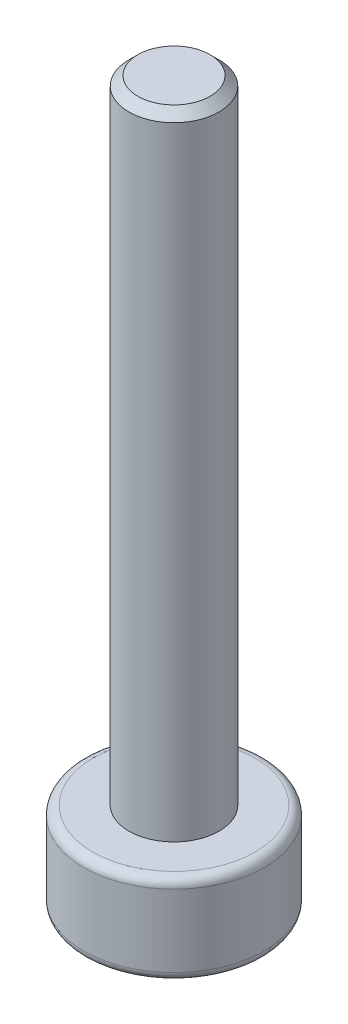
ISO-10303-21;
HEADER;
FILE_DESCRIPTION(('STEP AP214'),'2;1');
FILE_NAME('part.step','',(''),(''),'','','');
FILE_SCHEMA(('AUTOMOTIVE_DESIGN { 1 0 10303 214 1 1 1 1 }'));
ENDSEC;
DATA;
#1=APPLICATION_CONTEXT('core data for automotive mechanical design processes');
#2=APPLICATION_PROTOCOL_DEFINITION('international standard','automotive_design',2000,#1);
#3=PRODUCT_CONTEXT('',#1,'mechanical');
#4=PRODUCT('Part','Part','',(#3));
#5=PRODUCT_RELATED_PRODUCT_CATEGORY('part','',(#4));
#6=PRODUCT_DEFINITION_FORMATION('','',#4);
#7=PRODUCT_DEFINITION_CONTEXT('part definition',#1,'design');
#8=PRODUCT_DEFINITION('design','',#6,#7);
#9=PRODUCT_DEFINITION_SHAPE('','',#8);
#10=(LENGTH_UNIT() NAMED_UNIT(*) SI_UNIT(.MILLI.,.METRE.));
#11=(NAMED_UNIT(*) PLANE_ANGLE_UNIT() SI_UNIT($,.RADIAN.));
#12=(NAMED_UNIT(*) SI_UNIT($,.STERADIAN.) SOLID_ANGLE_UNIT());
#13=UNCERTAINTY_MEASURE_WITH_UNIT(LENGTH_MEASURE(1.E-05),#10,'distance_accuracy_value','');
#14=(GEOMETRIC_REPRESENTATION_CONTEXT(3) GLOBAL_UNCERTAINTY_ASSIGNED_CONTEXT((#13)) GLOBAL_UNIT_ASSIGNED_CONTEXT((#10,
#11,#12)) REPRESENTATION_CONTEXT('',''));
#15=CARTESIAN_POINT('',(0.,0.,0.));
#16=DIRECTION('',(0.,0.,1.));
#17=DIRECTION('',(1.,0.,0.));
#18=AXIS2_PLACEMENT_3D('',#15,#16,#17);
#19=CARTESIAN_POINT('',(0.,2.,0.));
#20=DIRECTION('',(0.,-1.,0.));
#21=DIRECTION('',(0.,0.,-1.));
#22=AXIS2_PLACEMENT_3D('',#19,#20,#21);
#23=CYLINDRICAL_SURFACE('',#22,2.);
#24=CARTESIAN_POINT('',(0.,0.2,0.));
#25=DIRECTION('',(0.,1.,0.));
#26=DIRECTION('',(0.,0.,1.));
#27=AXIS2_PLACEMENT_3D('',#24,#25,#26);
#28=CIRCLE('',#27,2.);
#29=CARTESIAN_POINT('',(0.,0.2,2.));
#30=VERTEX_POINT('',#29);
#31=EDGE_CURVE('E72',#30,#30,#28,.T.);
#32=ORIENTED_EDGE('',*,*,#31,.T.);
#33=EDGE_LOOP('',(#32));
#34=FACE_BOUND('',#33,.T.);
#35=CARTESIAN_POINT('',(0.,1.8,0.));
#36=DIRECTION('',(0.,1.,0.));
#37=DIRECTION('',(0.,0.,1.));
#38=AXIS2_PLACEMENT_3D('',#35,#36,#37);
#39=CIRCLE('',#38,2.);
#40=CARTESIAN_POINT('',(0.,1.8,2.));
#41=VERTEX_POINT('',#40);
#42=EDGE_CURVE('E76',#41,#41,#39,.F.);
#43=ORIENTED_EDGE('',*,*,#42,.T.);
#44=EDGE_LOOP('',(#43));
#45=FACE_BOUND('',#44,.T.);
#46=ADVANCED_FACE('F39',(#34,#45),#23,.T.);
#47=CARTESIAN_POINT('',(0.,2.,0.));
#48=DIRECTION('',(0.,1.,0.));
#49=DIRECTION('',(0.,0.,1.));
#50=AXIS2_PLACEMENT_3D('',#47,#48,#49);
#51=PLANE('',#50);
#52=CARTESIAN_POINT('',(0.,2.,0.));
#53=DIRECTION('',(0.,1.,0.));
#54=DIRECTION('',(0.,0.,1.));
#55=AXIS2_PLACEMENT_3D('',#52,#53,#54);
#56=CIRCLE('',#55,1.8);
#57=CARTESIAN_POINT('',(0.,2.,1.8));
#58=VERTEX_POINT('',#57);
#59=EDGE_CURVE('E64',#58,#58,#56,.T.);
#60=ORIENTED_EDGE('',*,*,#59,.T.);
#61=EDGE_LOOP('',(#60));
#62=FACE_BOUND('',#61,.T.);
#63=CARTESIAN_POINT('',(0.,2.,0.));
#64=DIRECTION('',(0.,1.,0.));
#65=DIRECTION('',(0.,0.,1.));
#66=AXIS2_PLACEMENT_3D('',#63,#64,#65);
#67=CIRCLE('',#66,1.);
#68=CARTESIAN_POINT('',(0.,2.,1.));
#69=VERTEX_POINT('',#68);
#70=EDGE_CURVE('E80',#69,#69,#67,.T.);
#71=ORIENTED_EDGE('',*,*,#70,.F.);
#72=EDGE_LOOP('',(#71));
#73=FACE_BOUND('',#72,.T.);
#74=ADVANCED_FACE('F107',(#62,#73),#51,.T.);
#75=CARTESIAN_POINT('',(0.,0.,0.));
#76=DIRECTION('',(0.,1.,0.));
#77=DIRECTION('',(0.,0.,1.));
#78=AXIS2_PLACEMENT_3D('',#75,#76,#77);
#79=PLANE('',#78);
#80=CARTESIAN_POINT('',(0.,0.,0.));
#81=DIRECTION('',(0.,1.,0.));
#82=DIRECTION('',(0.,0.,1.));
#83=AXIS2_PLACEMENT_3D('',#80,#81,#82);
#84=CIRCLE('',#83,0.864999999999998);
#85=CARTESIAN_POINT('',(0.,0.,-0.864999999999998));
#86=VERTEX_POINT('',#85);
#87=EDGE_CURVE('E53',#86,#86,#84,.T.);
#88=ORIENTED_EDGE('',*,*,#87,.T.);
#89=EDGE_LOOP('',(#88));
#90=FACE_BOUND('',#89,.T.);
#91=CARTESIAN_POINT('',(0.,0.,0.));
#92=DIRECTION('',(0.,1.,0.));
#93=DIRECTION('',(0.,0.,1.));
#94=AXIS2_PLACEMENT_3D('',#91,#92,#93);
#95=CIRCLE('',#94,1.8);
#96=CARTESIAN_POINT('',(0.,0.,1.8));
#97=VERTEX_POINT('',#96);
#98=EDGE_CURVE('E68',#97,#97,#95,.F.);
#99=ORIENTED_EDGE('',*,*,#98,.T.);
#100=EDGE_LOOP('',(#99));
#101=FACE_BOUND('',#100,.T.);
#102=ADVANCED_FACE('F113',(#90,#101),#79,.F.);
#103=CARTESIAN_POINT('',(0.,16.,0.));
#104=DIRECTION('',(0.,-1.,0.));
#105=DIRECTION('',(0.,0.,-1.));
#106=AXIS2_PLACEMENT_3D('',#103,#104,#105);
#107=CYLINDRICAL_SURFACE('',#106,1.);
#108=CARTESIAN_POINT('',(0.,15.8,0.));
#109=DIRECTION('',(0.,1.,0.));
#110=DIRECTION('',(0.,0.,1.));
#111=AXIS2_PLACEMENT_3D('',#108,#109,#110);
#112=CIRCLE('',#111,1.);
#113=CARTESIAN_POINT('',(0.,15.8,1.));
#114=VERTEX_POINT('',#113);
#115=EDGE_CURVE('E10',#114,#114,#112,.F.);
#116=ORIENTED_EDGE('',*,*,#115,.T.);
#117=EDGE_LOOP('',(#116));
#118=FACE_BOUND('',#117,.T.);
#119=ORIENTED_EDGE('',*,*,#70,.T.);
#120=EDGE_LOOP('',(#119));
#121=FACE_BOUND('',#120,.T.);
#122=ADVANCED_FACE('F137',(#118,#121),#107,.T.);
#123=CARTESIAN_POINT('',(0.,16.,0.));
#124=DIRECTION('',(0.,1.,0.));
#125=DIRECTION('',(0.,0.,1.));
#126=AXIS2_PLACEMENT_3D('',#123,#124,#125);
#127=PLANE('',#126);
#128=CARTESIAN_POINT('',(0.,16.,0.));
#129=DIRECTION('',(0.,1.,0.));
#130=DIRECTION('',(0.,0.,1.));
#131=AXIS2_PLACEMENT_3D('',#128,#129,#130);
#132=CIRCLE('',#131,0.800000000000002);
#133=CARTESIAN_POINT('',(0.,16.,0.800000000000002));
#134=VERTEX_POINT('',#133);
#135=EDGE_CURVE('E48',#134,#134,#132,.T.);
#136=ORIENTED_EDGE('',*,*,#135,.T.);
#137=EDGE_LOOP('',(#136));
#138=FACE_BOUND('',#137,.T.);
#139=ADVANCED_FACE('F120',(#138),#127,.T.);
#140=CARTESIAN_POINT('',(0.,0.2,0.));
#141=DIRECTION('',(0.,1.,0.));
#142=DIRECTION('',(0.,0.,1.));
#143=AXIS2_PLACEMENT_3D('',#140,#141,#142);
#144=TOROIDAL_SURFACE('',#143,1.8,0.2);
#145=ORIENTED_EDGE('',*,*,#98,.F.);
#146=EDGE_LOOP('',(#145));
#147=FACE_BOUND('',#146,.T.);
#148=ORIENTED_EDGE('',*,*,#31,.F.);
#149=EDGE_LOOP('',(#148));
#150=FACE_BOUND('',#149,.T.);
#151=ADVANCED_FACE('F102',(#147,#150),#144,.T.);
#152=CARTESIAN_POINT('',(0.,1.8,0.));
#153=DIRECTION('',(0.,1.,0.));
#154=DIRECTION('',(0.,0.,1.));
#155=AXIS2_PLACEMENT_3D('',#152,#153,#154);
#156=TOROIDAL_SURFACE('',#155,1.8,0.2);
#157=ORIENTED_EDGE('',*,*,#42,.F.);
#158=EDGE_LOOP('',(#157));
#159=FACE_BOUND('',#158,.T.);
#160=ORIENTED_EDGE('',*,*,#59,.F.);
#161=EDGE_LOOP('',(#160));
#162=FACE_BOUND('',#161,.T.);
#163=ADVANCED_FACE('F93',(#159,#162),#156,.T.);
#164=CARTESIAN_POINT('',(0.,1.52,0.));
#165=DIRECTION('',(0.,-1.,0.));
#166=DIRECTION('',(0.,0.,-1.));
#167=AXIS2_PLACEMENT_3D('',#164,#165,#166);
#168=CYLINDRICAL_SURFACE('',#167,0.765);
#169=CARTESIAN_POINT('',(0.,0.0999999999999968,0.));
#170=DIRECTION('',(0.,1.,0.));
#171=DIRECTION('',(0.,0.,1.));
#172=AXIS2_PLACEMENT_3D('',#169,#170,#171);
#173=CIRCLE('',#172,0.765);
#174=CARTESIAN_POINT('',(0.,0.0999999999999968,-0.765));
#175=VERTEX_POINT('',#174);
#176=EDGE_CURVE('E58',#175,#175,#173,.F.);
#177=ORIENTED_EDGE('',*,*,#176,.T.);
#178=EDGE_LOOP('',(#177));
#179=FACE_BOUND('',#178,.T.);
#180=CARTESIAN_POINT('',(0.,1.52,0.));
#181=DIRECTION('',(0.,-1.,0.));
#182=DIRECTION('',(0.,0.,-1.));
#183=AXIS2_PLACEMENT_3D('',#180,#181,#182);
#184=CIRCLE('',#183,0.765);
#185=CARTESIAN_POINT('',(0.,1.52,-0.765));
#186=VERTEX_POINT('',#185);
#187=EDGE_CURVE('E84',#186,#186,#184,.T.);
#188=ORIENTED_EDGE('',*,*,#187,.F.);
#189=EDGE_LOOP('',(#188));
#190=FACE_BOUND('',#189,.T.);
#191=ADVANCED_FACE('F91',(#179,#190),#168,.F.);
#192=CARTESIAN_POINT('',(0.,1.52,0.));
#193=DIRECTION('',(0.,-1.,0.));
#194=DIRECTION('',(0.,0.,-1.));
#195=AXIS2_PLACEMENT_3D('',#192,#193,#194);
#196=PLANE('',#195);
#197=ORIENTED_EDGE('',*,*,#187,.T.);
#198=EDGE_LOOP('',(#197));
#199=FACE_BOUND('',#198,.T.);
#200=ADVANCED_FACE('F89',(#199),#196,.T.);
#201=CARTESIAN_POINT('',(0.,0.0999999999999968,0.));
#202=DIRECTION('',(0.,-1.,0.));
#203=DIRECTION('',(0.,0.,-1.));
#204=AXIS2_PLACEMENT_3D('',#201,#202,#203);
#205=CONICAL_SURFACE('',#204,0.765,0.785398163397452);
#206=CARTESIAN_POINT('',(0.,0.,-0.864999999999998));
#207=CARTESIAN_POINT('',(0.,0.00104166666666665,-0.863958333333331));
#208=CARTESIAN_POINT('',(0.,0.00208333333333327,-0.862916666666664));
#209=CARTESIAN_POINT('',(0.,0.00416666666666652,-0.860833333333331));
#210=CARTESIAN_POINT('',(0.,0.00520833333333314,-0.859791666666664));
#211=CARTESIAN_POINT('',(0.,0.00729166666666641,-0.857708333333331));
#212=CARTESIAN_POINT('',(0.,0.00833333333333306,-0.856666666666665));
#213=CARTESIAN_POINT('',(0.,0.0104166666666663,-0.854583333333331));
#214=CARTESIAN_POINT('',(0.,0.0114583333333329,-0.853541666666665));
#215=CARTESIAN_POINT('',(0.,0.0135416666666662,-0.851458333333331));
#216=CARTESIAN_POINT('',(0.,0.0145833333333329,-0.850416666666665));
#217=CARTESIAN_POINT('',(0.,0.0166666666666661,-0.848333333333331));
#218=CARTESIAN_POINT('',(0.,0.0177083333333327,-0.847291666666665));
#219=CARTESIAN_POINT('',(0.,0.019791666666666,-0.845208333333331));
#220=CARTESIAN_POINT('',(0.,0.0208333333333326,-0.844166666666665));
#221=CARTESIAN_POINT('',(0.,0.0229166666666659,-0.842083333333332));
#222=CARTESIAN_POINT('',(0.,0.0239583333333326,-0.841041666666665));
#223=CARTESIAN_POINT('',(0.,0.0260416666666658,-0.838958333333332));
#224=CARTESIAN_POINT('',(0.,0.0270833333333325,-0.837916666666665));
#225=CARTESIAN_POINT('',(0.,0.0291666666666657,-0.835833333333332));
#226=CARTESIAN_POINT('',(0.,0.0302083333333323,-0.834791666666665));
#227=CARTESIAN_POINT('',(0.,0.0322916666666656,-0.832708333333332));
#228=CARTESIAN_POINT('',(0.,0.0333333333333322,-0.831666666666665));
#229=CARTESIAN_POINT('',(0.,0.0354166666666655,-0.829583333333332));
#230=CARTESIAN_POINT('',(0.,0.0364583333333322,-0.828541666666665));
#231=CARTESIAN_POINT('',(0.,0.0385416666666654,-0.826458333333332));
#232=CARTESIAN_POINT('',(0.,0.039583333333332,-0.825416666666665));
#233=CARTESIAN_POINT('',(0.,0.0416666666666653,-0.823333333333332));
#234=CARTESIAN_POINT('',(0.,0.042708333333332,-0.822291666666665));
#235=CARTESIAN_POINT('',(0.,0.0447916666666652,-0.820208333333332));
#236=CARTESIAN_POINT('',(0.,0.0458333333333319,-0.819166666666665));
#237=CARTESIAN_POINT('',(0.,0.0479166666666651,-0.817083333333332));
#238=CARTESIAN_POINT('',(0.,0.0489583333333318,-0.816041666666666));
#239=CARTESIAN_POINT('',(0.,0.051041666666665,-0.813958333333332));
#240=CARTESIAN_POINT('',(0.,0.0520833333333316,-0.812916666666666));
#241=CARTESIAN_POINT('',(0.,0.0541666666666649,-0.810833333333332));
#242=CARTESIAN_POINT('',(0.,0.0552083333333316,-0.809791666666666));
#243=CARTESIAN_POINT('',(0.,0.0572916666666648,-0.807708333333332));
#244=CARTESIAN_POINT('',(0.,0.0583333333333314,-0.806666666666666));
#245=CARTESIAN_POINT('',(0.,0.0604166666666647,-0.804583333333332));
#246=CARTESIAN_POINT('',(0.,0.0614583333333314,-0.803541666666666));
#247=CARTESIAN_POINT('',(0.,0.0635416666666646,-0.801458333333332));
#248=CARTESIAN_POINT('',(0.,0.0645833333333312,-0.800416666666666));
#249=CARTESIAN_POINT('',(0.,0.0666666666666645,-0.798333333333333));
#250=CARTESIAN_POINT('',(0.,0.0677083333333312,-0.797291666666666));
#251=CARTESIAN_POINT('',(0.,0.0697916666666644,-0.795208333333333));
#252=CARTESIAN_POINT('',(0.,0.070833333333331,-0.794166666666666));
#253=CARTESIAN_POINT('',(0.,0.0729166666666643,-0.792083333333333));
#254=CARTESIAN_POINT('',(0.,0.073958333333331,-0.791041666666666));
#255=CARTESIAN_POINT('',(0.,0.0760416666666642,-0.788958333333333));
#256=CARTESIAN_POINT('',(0.,0.0770833333333309,-0.787916666666666));
#257=CARTESIAN_POINT('',(0.,0.0791666666666641,-0.785833333333333));
#258=CARTESIAN_POINT('',(0.,0.0802083333333308,-0.784791666666666));
#259=CARTESIAN_POINT('',(0.,0.082291666666664,-0.782708333333333));
#260=CARTESIAN_POINT('',(0.,0.0833333333333307,-0.781666666666666));
#261=CARTESIAN_POINT('',(0.,0.0854166666666639,-0.779583333333333));
#262=CARTESIAN_POINT('',(0.,0.0864583333333306,-0.778541666666666));
#263=CARTESIAN_POINT('',(0.,0.0885416666666638,-0.776458333333333));
#264=CARTESIAN_POINT('',(0.,0.0895833333333304,-0.775416666666666));
#265=CARTESIAN_POINT('',(0.,0.0916666666666637,-0.773333333333333));
#266=CARTESIAN_POINT('',(0.,0.0927083333333304,-0.772291666666667));
#267=CARTESIAN_POINT('',(0.,0.0947916666666636,-0.770208333333333));
#268=CARTESIAN_POINT('',(0.,0.0958333333333303,-0.769166666666667));
#269=CARTESIAN_POINT('',(0.,0.0979166666666635,-0.767083333333333));
#270=CARTESIAN_POINT('',(0.,0.0989583333333301,-0.766041666666667));
#271=CARTESIAN_POINT('',(0.,0.0999999999999968,-0.765));
#272=B_SPLINE_CURVE_WITH_KNOTS('',3,(#206,#207,#208,#209,#210,#211,#212,#213,#214,#215,#216,
#217,#218,#219,#220,#221,#222,#223,#224,#225,#226,#227,#228,#229,#230,#231,#232,#233,#234,#235,
#236,#237,#238,#239,#240,#241,#242,#243,#244,#245,#246,#247,#248,#249,#250,#251,#252,#253,#254,
#255,#256,#257,#258,#259,#260,#261,#262,#263,#264,#265,#266,#267,#268,#269,#270,#271),
.UNSPECIFIED.,.F.,.F.,(4,2,2,2,2,2,2,2,2,2,2,2,2,2,2,2,2,2,2,2,2,2,2,2,2,2,2,2,2,2,2,2,4),(0.,
0.00441941738241576,0.0088388347648316,0.0132582521472474,0.0176776695296632,0.022097086912079,
0.0265165042944948,0.0309359216769106,0.0353553390593263,0.0397747564417422,0.044194173824158,
0.0486135912065737,0.0530330085889895,0.0574524259714054,0.0618718433538211,0.066291260736237,
0.0707106781186527,0.0751300955010686,0.0795495128834843,0.0839689302659001,0.0883883476483159,
0.0928077650307318,0.0972271824131475,0.101646599795563,0.106066017177979,0.110485434560395,
0.114904851942811,0.119324269325227,0.123743686707642,0.128163104090058,0.132582521472474,
0.13700193885489,0.141421356237306),.UNSPECIFIED.);
#273=EDGE_CURVE('BSEAM100',#86,#175,#272,.T.);
#274=ORIENTED_EDGE('',*,*,#87,.F.);
#275=ORIENTED_EDGE('',*,*,#176,.F.);
#276=ORIENTED_EDGE('',*,*,#273,.T.);
#277=ORIENTED_EDGE('',*,*,#273,.F.);
#278=EDGE_LOOP('',(#274,#276,#275,#277));
#279=FACE_BOUND('',#278,.T.);
#280=ADVANCED_FACE('F100',(#279),#205,.F.);
#281=CARTESIAN_POINT('',(0.,16.,0.));
#282=DIRECTION('',(0.,-1.,0.));
#283=DIRECTION('',(0.,0.,-1.));
#284=AXIS2_PLACEMENT_3D('',#281,#282,#283);
#285=CONICAL_SURFACE('',#284,0.800000000000002,0.785398163397438);
#286=ORIENTED_EDGE('',*,*,#115,.F.);
#287=EDGE_LOOP('',(#286));
#288=FACE_BOUND('',#287,.T.);
#289=ORIENTED_EDGE('',*,*,#135,.F.);
#290=EDGE_LOOP('',(#289));
#291=FACE_BOUND('',#290,.T.);
#292=ADVANCED_FACE('F42',(#288,#291),#285,.T.);
#293=CLOSED_SHELL('',(#46,#74,#102,#122,#139,#151,#163,#191,#200,#280,#292));
#294=MANIFOLD_SOLID_BREP('B2',#293);
#295=ADVANCED_BREP_SHAPE_REPRESENTATION('',(#18,#294),#14);
#296=SHAPE_DEFINITION_REPRESENTATION(#9,#295);
ENDSEC;
END-ISO-10303-21;
